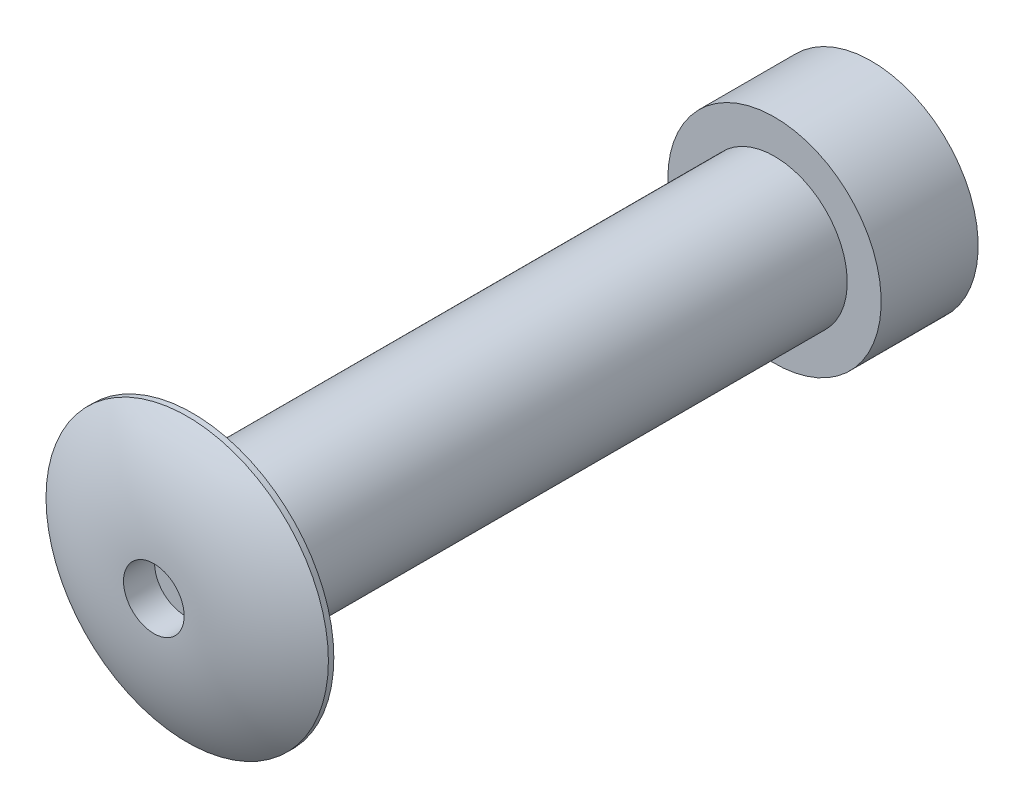
ISO-10303-21;
HEADER;
FILE_DESCRIPTION(('STEP AP214'),'2;1');
FILE_NAME('part.step','',(''),(''),'','','');
FILE_SCHEMA(('AUTOMOTIVE_DESIGN { 1 0 10303 214 1 1 1 1 }'));
ENDSEC;
DATA;
#1=APPLICATION_CONTEXT('core data for automotive mechanical design processes');
#2=APPLICATION_PROTOCOL_DEFINITION('international standard','automotive_design',2000,#1);
#3=PRODUCT_CONTEXT('',#1,'mechanical');
#4=PRODUCT('Part','Part','',(#3));
#5=PRODUCT_RELATED_PRODUCT_CATEGORY('part','',(#4));
#6=PRODUCT_DEFINITION_FORMATION('','',#4);
#7=PRODUCT_DEFINITION_CONTEXT('part definition',#1,'design');
#8=PRODUCT_DEFINITION('design','',#6,#7);
#9=PRODUCT_DEFINITION_SHAPE('','',#8);
#10=(LENGTH_UNIT() NAMED_UNIT(*) SI_UNIT(.MILLI.,.METRE.));
#11=(NAMED_UNIT(*) PLANE_ANGLE_UNIT() SI_UNIT($,.RADIAN.));
#12=(NAMED_UNIT(*) SI_UNIT($,.STERADIAN.) SOLID_ANGLE_UNIT());
#13=UNCERTAINTY_MEASURE_WITH_UNIT(LENGTH_MEASURE(1.E-05),#10,'distance_accuracy_value','');
#14=(GEOMETRIC_REPRESENTATION_CONTEXT(3) GLOBAL_UNCERTAINTY_ASSIGNED_CONTEXT((#13)) GLOBAL_UNIT_ASSIGNED_CONTEXT((#10,
#11,#12)) REPRESENTATION_CONTEXT('',''));
#15=CARTESIAN_POINT('',(0.,0.,0.));
#16=DIRECTION('',(0.,0.,1.));
#17=DIRECTION('',(1.,0.,0.));
#18=AXIS2_PLACEMENT_3D('',#15,#16,#17);
#19=CARTESIAN_POINT('',(0.,3.4925,-22.225));
#20=DIRECTION('',(0.,0.,-1.));
#21=DIRECTION('',(-1.,0.,0.));
#22=AXIS2_PLACEMENT_3D('',#19,#20,#21);
#23=PLANE('',#22);
#24=CARTESIAN_POINT('',(0.,0.,-22.225));
#25=DIRECTION('',(0.,0.,-1.));
#26=DIRECTION('',(-1.,0.,0.));
#27=AXIS2_PLACEMENT_3D('',#24,#25,#26);
#28=CIRCLE('',#27,0.992187500000002);
#29=CARTESIAN_POINT('',(-0.992187500000002,0.,-22.225));
#30=VERTEX_POINT('',#29);
#31=EDGE_CURVE('E86',#30,#30,#28,.T.);
#32=ORIENTED_EDGE('',*,*,#31,.F.);
#33=EDGE_LOOP('',(#32));
#34=FACE_BOUND('',#33,.T.);
#35=CARTESIAN_POINT('',(0.,0.,-22.225));
#36=DIRECTION('',(0.,0.,-1.));
#37=DIRECTION('',(-1.,0.,0.));
#38=AXIS2_PLACEMENT_3D('',#35,#36,#37);
#39=CIRCLE('',#38,3.4925);
#40=CARTESIAN_POINT('',(-3.4925,0.,-22.225));
#41=VERTEX_POINT('',#40);
#42=EDGE_CURVE('E10',#41,#41,#39,.T.);
#43=ORIENTED_EDGE('',*,*,#42,.T.);
#44=EDGE_LOOP('',(#43));
#45=FACE_BOUND('',#44,.T.);
#46=ADVANCED_FACE('F46',(#34,#45),#23,.T.);
#47=CARTESIAN_POINT('',(0.,0.,7.60058061624149));
#48=DIRECTION('',(0.,0.,-1.));
#49=DIRECTION('',(-1.,0.,0.));
#50=AXIS2_PLACEMENT_3D('',#47,#48,#49);
#51=CYLINDRICAL_SURFACE('',#50,3.4925);
#52=CARTESIAN_POINT('',(0.,0.,-19.05));
#53=DIRECTION('',(0.,0.,-1.));
#54=DIRECTION('',(-1.,0.,0.));
#55=AXIS2_PLACEMENT_3D('',#52,#53,#54);
#56=CIRCLE('',#55,3.4925);
#57=CARTESIAN_POINT('',(-3.4925,0.,-19.05));
#58=VERTEX_POINT('',#57);
#59=EDGE_CURVE('E53',#58,#58,#56,.T.);
#60=ORIENTED_EDGE('',*,*,#59,.T.);
#61=EDGE_LOOP('',(#60));
#62=FACE_BOUND('',#61,.T.);
#63=ORIENTED_EDGE('',*,*,#42,.F.);
#64=EDGE_LOOP('',(#63));
#65=FACE_BOUND('',#64,.T.);
#66=ADVANCED_FACE('F104',(#62,#65),#51,.T.);
#67=CARTESIAN_POINT('',(0.,2.38125,-19.05));
#68=DIRECTION('',(0.,0.,1.));
#69=DIRECTION('',(1.,0.,0.));
#70=AXIS2_PLACEMENT_3D('',#67,#68,#69);
#71=PLANE('',#70);
#72=CARTESIAN_POINT('',(0.,0.,-19.05));
#73=DIRECTION('',(0.,0.,-1.));
#74=DIRECTION('',(-1.,0.,0.));
#75=AXIS2_PLACEMENT_3D('',#72,#73,#74);
#76=CIRCLE('',#75,2.38125);
#77=CARTESIAN_POINT('',(-2.38125,0.,-19.05));
#78=VERTEX_POINT('',#77);
#79=EDGE_CURVE('E58',#78,#78,#76,.T.);
#80=ORIENTED_EDGE('',*,*,#79,.T.);
#81=EDGE_LOOP('',(#80));
#82=FACE_BOUND('',#81,.T.);
#83=ORIENTED_EDGE('',*,*,#59,.F.);
#84=EDGE_LOOP('',(#83));
#85=FACE_BOUND('',#84,.T.);
#86=ADVANCED_FACE('F109',(#82,#85),#71,.T.);
#87=CARTESIAN_POINT('',(0.,0.,7.60058061624149));
#88=DIRECTION('',(0.,0.,-1.));
#89=DIRECTION('',(-1.,0.,0.));
#90=AXIS2_PLACEMENT_3D('',#87,#88,#89);
#91=CYLINDRICAL_SURFACE('',#90,2.38125);
#92=CARTESIAN_POINT('',(0.,0.,0.));
#93=DIRECTION('',(0.,0.,-1.));
#94=DIRECTION('',(-1.,0.,0.));
#95=AXIS2_PLACEMENT_3D('',#92,#93,#94);
#96=CIRCLE('',#95,2.38125);
#97=CARTESIAN_POINT('',(-2.38125,0.,0.));
#98=VERTEX_POINT('',#97);
#99=EDGE_CURVE('E63',#98,#98,#96,.T.);
#100=ORIENTED_EDGE('',*,*,#99,.T.);
#101=EDGE_LOOP('',(#100));
#102=FACE_BOUND('',#101,.T.);
#103=ORIENTED_EDGE('',*,*,#79,.F.);
#104=EDGE_LOOP('',(#103));
#105=FACE_BOUND('',#104,.T.);
#106=ADVANCED_FACE('F113',(#102,#105),#91,.T.);
#107=CARTESIAN_POINT('',(0.,2.38125,0.));
#108=DIRECTION('',(0.,0.,-1.));
#109=DIRECTION('',(-1.,0.,0.));
#110=AXIS2_PLACEMENT_3D('',#107,#108,#109);
#111=PLANE('',#110);
#112=CARTESIAN_POINT('',(0.,0.,0.));
#113=DIRECTION('',(0.,0.,-1.));
#114=DIRECTION('',(-1.,0.,0.));
#115=AXIS2_PLACEMENT_3D('',#112,#113,#114);
#116=CIRCLE('',#115,4.6228);
#117=CARTESIAN_POINT('',(-4.6228,0.,0.));
#118=VERTEX_POINT('',#117);
#119=EDGE_CURVE('E69',#118,#118,#116,.T.);
#120=ORIENTED_EDGE('',*,*,#119,.T.);
#121=EDGE_LOOP('',(#120));
#122=FACE_BOUND('',#121,.T.);
#123=ORIENTED_EDGE('',*,*,#99,.F.);
#124=EDGE_LOOP('',(#123));
#125=FACE_BOUND('',#124,.T.);
#126=ADVANCED_FACE('F120',(#122,#125),#111,.T.);
#127=CARTESIAN_POINT('',(0.,0.,7.60058061624149));
#128=DIRECTION('',(0.,0.,-1.));
#129=DIRECTION('',(-1.,0.,0.));
#130=AXIS2_PLACEMENT_3D('',#127,#128,#129);
#131=CYLINDRICAL_SURFACE('',#130,4.6228);
#132=CARTESIAN_POINT('',(0.,0.,0.177799999999999));
#133=DIRECTION('',(0.,0.,-1.));
#134=DIRECTION('',(-1.,0.,0.));
#135=AXIS2_PLACEMENT_3D('',#132,#133,#134);
#136=CIRCLE('',#135,4.6228);
#137=CARTESIAN_POINT('',(-4.6228,0.,0.177799999999999));
#138=VERTEX_POINT('',#137);
#139=EDGE_CURVE('E73',#138,#138,#136,.T.);
#140=ORIENTED_EDGE('',*,*,#139,.T.);
#141=EDGE_LOOP('',(#140));
#142=FACE_BOUND('',#141,.T.);
#143=ORIENTED_EDGE('',*,*,#119,.F.);
#144=EDGE_LOOP('',(#143));
#145=FACE_BOUND('',#144,.T.);
#146=ADVANCED_FACE('F124',(#142,#145),#131,.T.);
#147=CARTESIAN_POINT('',(0.,0.,-5.31041016533429));
#148=DIRECTION('',(0.,0.,-1.));
#149=DIRECTION('',(-1.,0.,0.));
#150=AXIS2_PLACEMENT_3D('',#147,#148,#149);
#151=DEGENERATE_TOROIDAL_SURFACE('',#150,0.992187500000001,6.58041016533429,.T.);
#152=CARTESIAN_POINT('',(0.,0.,1.27));
#153=DIRECTION('',(0.,0.,1.));
#154=DIRECTION('',(1.,0.,0.));
#155=AXIS2_PLACEMENT_3D('',#152,#153,#154);
#156=CIRCLE('',#155,0.992187500000002);
#157=CARTESIAN_POINT('',(0.992187500000002,0.,1.27));
#158=VERTEX_POINT('',#157);
#159=EDGE_CURVE('E78',#158,#158,#156,.T.);
#160=ORIENTED_EDGE('',*,*,#159,.F.);
#161=EDGE_LOOP('',(#160));
#162=FACE_BOUND('',#161,.T.);
#163=ORIENTED_EDGE('',*,*,#139,.F.);
#164=EDGE_LOOP('',(#163));
#165=FACE_BOUND('',#164,.T.);
#166=ADVANCED_FACE('F128',(#162,#165),#151,.T.);
#167=CARTESIAN_POINT('',(0.,0.,0.254));
#168=DIRECTION('',(0.,0.,1.));
#169=DIRECTION('',(1.,0.,0.));
#170=AXIS2_PLACEMENT_3D('',#167,#168,#169);
#171=CYLINDRICAL_SURFACE('',#170,0.992187500000002);
#172=CARTESIAN_POINT('',(0.,0.,0.254));
#173=DIRECTION('',(0.,0.,1.));
#174=DIRECTION('',(1.,0.,0.));
#175=AXIS2_PLACEMENT_3D('',#172,#173,#174);
#176=CIRCLE('',#175,0.992187500000002);
#177=CARTESIAN_POINT('',(0.992187500000002,0.,0.254));
#178=VERTEX_POINT('',#177);
#179=EDGE_CURVE('E77',#178,#178,#176,.T.);
#180=ORIENTED_EDGE('',*,*,#179,.F.);
#181=EDGE_LOOP('',(#180));
#182=FACE_BOUND('',#181,.T.);
#183=ORIENTED_EDGE('',*,*,#159,.T.);
#184=EDGE_LOOP('',(#183));
#185=FACE_BOUND('',#184,.T.);
#186=ADVANCED_FACE('F132',(#182,#185),#171,.F.);
#187=CARTESIAN_POINT('',(0.,0.,0.254));
#188=DIRECTION('',(0.,0.,1.));
#189=DIRECTION('',(1.,0.,0.));
#190=AXIS2_PLACEMENT_3D('',#187,#188,#189);
#191=PLANE('',#190);
#192=ORIENTED_EDGE('',*,*,#179,.T.);
#193=EDGE_LOOP('',(#192));
#194=FACE_BOUND('',#193,.T.);
#195=ADVANCED_FACE('F99',(#194),#191,.T.);
#196=CARTESIAN_POINT('',(0.,0.,-19.685));
#197=DIRECTION('',(0.,0.,-1.));
#198=DIRECTION('',(-1.,0.,0.));
#199=AXIS2_PLACEMENT_3D('',#196,#197,#198);
#200=CYLINDRICAL_SURFACE('',#199,0.992187500000002);
#201=CARTESIAN_POINT('',(0.,0.,-19.685));
#202=DIRECTION('',(0.,0.,-1.));
#203=DIRECTION('',(-1.,0.,0.));
#204=AXIS2_PLACEMENT_3D('',#201,#202,#203);
#205=CIRCLE('',#204,0.992187500000002);
#206=CARTESIAN_POINT('',(-0.992187500000002,0.,-19.685));
#207=VERTEX_POINT('',#206);
#208=EDGE_CURVE('E82',#207,#207,#205,.T.);
#209=ORIENTED_EDGE('',*,*,#208,.F.);
#210=EDGE_LOOP('',(#209));
#211=FACE_BOUND('',#210,.T.);
#212=ORIENTED_EDGE('',*,*,#31,.T.);
#213=EDGE_LOOP('',(#212));
#214=FACE_BOUND('',#213,.T.);
#215=ADVANCED_FACE('F96',(#211,#214),#200,.F.);
#216=CARTESIAN_POINT('',(0.,0.,-19.685));
#217=DIRECTION('',(0.,0.,-1.));
#218=DIRECTION('',(-1.,0.,0.));
#219=AXIS2_PLACEMENT_3D('',#216,#217,#218);
#220=PLANE('',#219);
#221=ORIENTED_EDGE('',*,*,#208,.T.);
#222=EDGE_LOOP('',(#221));
#223=FACE_BOUND('',#222,.T.);
#224=ADVANCED_FACE('F94',(#223),#220,.T.);
#225=CLOSED_SHELL('',(#46,#66,#86,#106,#126,#146,#166,#186,#195,#215,#224));
#226=MANIFOLD_SOLID_BREP('B2',#225);
#227=ADVANCED_BREP_SHAPE_REPRESENTATION('',(#18,#226),#14);
#228=SHAPE_DEFINITION_REPRESENTATION(#9,#227);
ENDSEC;
END-ISO-10303-21;
